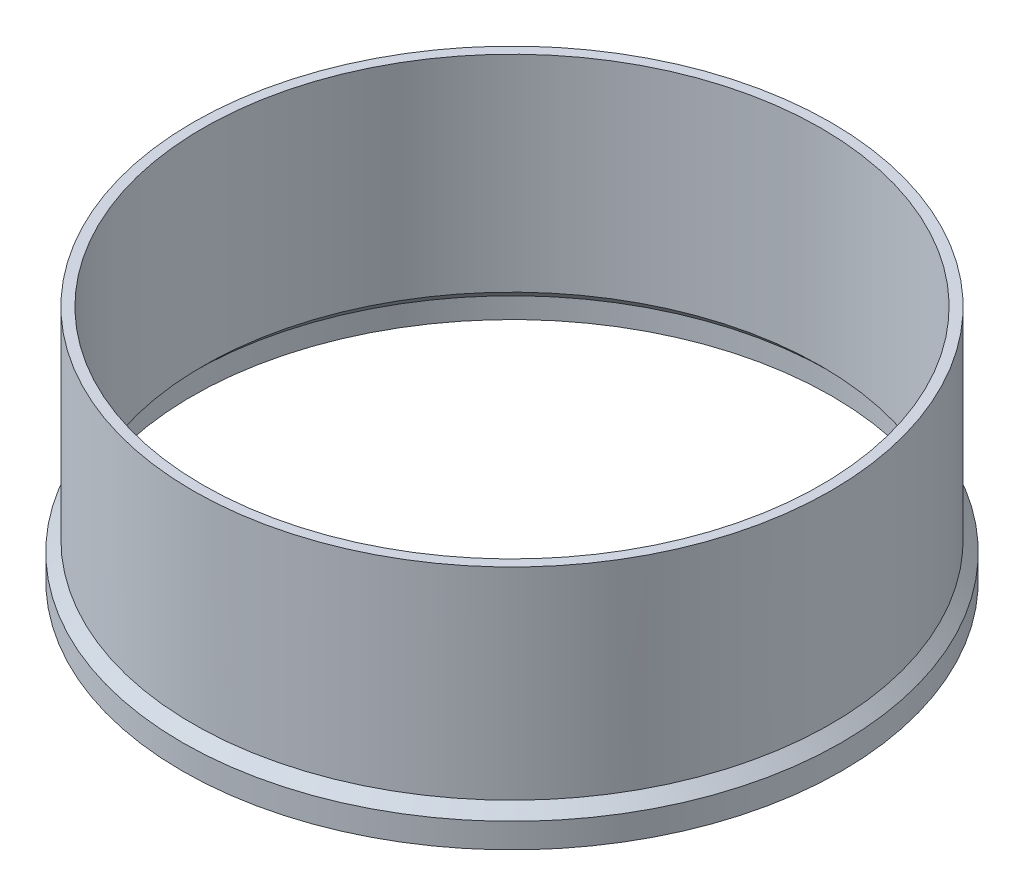
ISO-10303-21;
HEADER;
FILE_DESCRIPTION(('STEP AP214'),'2;1');
FILE_NAME('part.step','',(''),(''),'','','');
FILE_SCHEMA(('AUTOMOTIVE_DESIGN { 1 0 10303 214 1 1 1 1 }'));
ENDSEC;
DATA;
#1=APPLICATION_CONTEXT('core data for automotive mechanical design processes');
#2=APPLICATION_PROTOCOL_DEFINITION('international standard','automotive_design',2000,#1);
#3=PRODUCT_CONTEXT('',#1,'mechanical');
#4=PRODUCT('Part','Part','',(#3));
#5=PRODUCT_RELATED_PRODUCT_CATEGORY('part','',(#4));
#6=PRODUCT_DEFINITION_FORMATION('','',#4);
#7=PRODUCT_DEFINITION_CONTEXT('part definition',#1,'design');
#8=PRODUCT_DEFINITION('design','',#6,#7);
#9=PRODUCT_DEFINITION_SHAPE('','',#8);
#10=(LENGTH_UNIT() NAMED_UNIT(*) SI_UNIT(.MILLI.,.METRE.));
#11=(NAMED_UNIT(*) PLANE_ANGLE_UNIT() SI_UNIT($,.RADIAN.));
#12=(NAMED_UNIT(*) SI_UNIT($,.STERADIAN.) SOLID_ANGLE_UNIT());
#13=UNCERTAINTY_MEASURE_WITH_UNIT(LENGTH_MEASURE(1.E-05),#10,'distance_accuracy_value','');
#14=(GEOMETRIC_REPRESENTATION_CONTEXT(3) GLOBAL_UNCERTAINTY_ASSIGNED_CONTEXT((#13)) GLOBAL_UNIT_ASSIGNED_CONTEXT((#10,
#11,#12)) REPRESENTATION_CONTEXT('',''));
#15=CARTESIAN_POINT('',(0.,0.,0.));
#16=DIRECTION('',(0.,0.,1.));
#17=DIRECTION('',(1.,0.,0.));
#18=AXIS2_PLACEMENT_3D('',#15,#16,#17);
#19=CARTESIAN_POINT('',(0.,50.,0.));
#20=DIRECTION('',(0.,1.,0.));
#21=DIRECTION('',(0.,0.,1.));
#22=AXIS2_PLACEMENT_3D('',#19,#20,#21);
#23=PLANE('',#22);
#24=CARTESIAN_POINT('',(0.,50.,0.));
#25=DIRECTION('',(0.,1.,0.));
#26=DIRECTION('',(0.,0.,1.));
#27=AXIS2_PLACEMENT_3D('',#24,#25,#26);
#28=CIRCLE('',#27,77.4);
#29=CARTESIAN_POINT('',(0.,50.,77.4));
#30=VERTEX_POINT('',#29);
#31=EDGE_CURVE('E10',#30,#30,#28,.T.);
#32=ORIENTED_EDGE('',*,*,#31,.T.);
#33=EDGE_LOOP('',(#32));
#34=FACE_BOUND('',#33,.T.);
#35=CARTESIAN_POINT('',(0.,50.,0.));
#36=DIRECTION('',(0.,1.,0.));
#37=DIRECTION('',(0.,0.,1.));
#38=AXIS2_PLACEMENT_3D('',#35,#36,#37);
#39=CIRCLE('',#38,75.);
#40=CARTESIAN_POINT('',(0.,50.,75.));
#41=VERTEX_POINT('',#40);
#42=EDGE_CURVE('E37',#41,#41,#39,.T.);
#43=ORIENTED_EDGE('',*,*,#42,.F.);
#44=EDGE_LOOP('',(#43));
#45=FACE_BOUND('',#44,.T.);
#46=ADVANCED_FACE('F30',(#34,#45),#23,.T.);
#47=CARTESIAN_POINT('',(0.,50.,0.));
#48=DIRECTION('',(0.,-1.,0.));
#49=DIRECTION('',(0.,0.,-1.));
#50=AXIS2_PLACEMENT_3D('',#47,#48,#49);
#51=CYLINDRICAL_SURFACE('',#50,77.4);
#52=CARTESIAN_POINT('',(0.,0.994112549695437,0.));
#53=DIRECTION('',(0.,-1.,0.));
#54=DIRECTION('',(0.,0.,-1.));
#55=AXIS2_PLACEMENT_3D('',#52,#53,#54);
#56=CIRCLE('',#55,77.4);
#57=CARTESIAN_POINT('',(0.,0.994112549695437,-77.4));
#58=VERTEX_POINT('',#57);
#59=EDGE_CURVE('E59',#58,#58,#56,.T.);
#60=ORIENTED_EDGE('',*,*,#59,.F.);
#61=EDGE_LOOP('',(#60));
#62=FACE_BOUND('',#61,.T.);
#63=ORIENTED_EDGE('',*,*,#31,.F.);
#64=EDGE_LOOP('',(#63));
#65=FACE_BOUND('',#64,.T.);
#66=ADVANCED_FACE('F32',(#62,#65),#51,.T.);
#67=CARTESIAN_POINT('',(0.,50.,0.));
#68=DIRECTION('',(0.,-1.,0.));
#69=DIRECTION('',(0.,0.,-1.));
#70=AXIS2_PLACEMENT_3D('',#67,#68,#69);
#71=CYLINDRICAL_SURFACE('',#70,75.);
#72=ORIENTED_EDGE('',*,*,#42,.T.);
#73=EDGE_LOOP('',(#72));
#74=FACE_BOUND('',#73,.T.);
#75=CARTESIAN_POINT('',(0.,0.,0.));
#76=DIRECTION('',(0.,1.,0.));
#77=DIRECTION('',(0.,0.,1.));
#78=AXIS2_PLACEMENT_3D('',#75,#76,#77);
#79=CIRCLE('',#78,75.);
#80=CARTESIAN_POINT('',(0.,0.,75.));
#81=VERTEX_POINT('',#80);
#82=EDGE_CURVE('E41',#81,#81,#79,.T.);
#83=ORIENTED_EDGE('',*,*,#82,.F.);
#84=EDGE_LOOP('',(#83));
#85=FACE_BOUND('',#84,.T.);
#86=ADVANCED_FACE('F68',(#74,#85),#71,.F.);
#87=CARTESIAN_POINT('',(0.,0.,0.));
#88=DIRECTION('',(0.,-1.,0.));
#89=DIRECTION('',(0.,0.,-1.));
#90=AXIS2_PLACEMENT_3D('',#87,#88,#89);
#91=CONICAL_SURFACE('',#90,75.,0.785398163397447);
#92=CARTESIAN_POINT('',(0.,-2.59999999999999,0.));
#93=DIRECTION('',(0.,-1.,0.));
#94=DIRECTION('',(0.,0.,-1.));
#95=AXIS2_PLACEMENT_3D('',#92,#93,#94);
#96=CIRCLE('',#95,77.6);
#97=CARTESIAN_POINT('',(0.,-2.59999999999999,-77.6));
#98=VERTEX_POINT('',#97);
#99=EDGE_CURVE('E46',#98,#98,#96,.T.);
#100=ORIENTED_EDGE('',*,*,#99,.T.);
#101=EDGE_LOOP('',(#100));
#102=FACE_BOUND('',#101,.T.);
#103=ORIENTED_EDGE('',*,*,#82,.T.);
#104=EDGE_LOOP('',(#103));
#105=FACE_BOUND('',#104,.T.);
#106=ADVANCED_FACE('F73',(#102,#105),#91,.F.);
#107=CARTESIAN_POINT('',(0.,0.,0.));
#108=DIRECTION('',(0.,-1.,0.));
#109=DIRECTION('',(0.,0.,-1.));
#110=AXIS2_PLACEMENT_3D('',#107,#108,#109);
#111=CYLINDRICAL_SURFACE('',#110,77.6);
#112=CARTESIAN_POINT('',(0.,-7.59999999999999,0.));
#113=DIRECTION('',(0.,-1.,0.));
#114=DIRECTION('',(0.,0.,-1.));
#115=AXIS2_PLACEMENT_3D('',#112,#113,#114);
#116=CIRCLE('',#115,77.6);
#117=CARTESIAN_POINT('',(0.,-7.59999999999999,-77.6));
#118=VERTEX_POINT('',#117);
#119=EDGE_CURVE('E50',#118,#118,#116,.T.);
#120=ORIENTED_EDGE('',*,*,#119,.T.);
#121=EDGE_LOOP('',(#120));
#122=FACE_BOUND('',#121,.T.);
#123=ORIENTED_EDGE('',*,*,#99,.F.);
#124=EDGE_LOOP('',(#123));
#125=FACE_BOUND('',#124,.T.);
#126=ADVANCED_FACE('F81',(#122,#125),#111,.F.);
#127=CARTESIAN_POINT('',(77.6,-7.59999999999999,0.));
#128=DIRECTION('',(0.,-1.,0.));
#129=DIRECTION('',(0.,0.,-1.));
#130=AXIS2_PLACEMENT_3D('',#127,#128,#129);
#131=PLANE('',#130);
#132=CARTESIAN_POINT('',(0.,-7.59999999999999,0.));
#133=DIRECTION('',(0.,-1.,0.));
#134=DIRECTION('',(0.,0.,-1.));
#135=AXIS2_PLACEMENT_3D('',#132,#133,#134);
#136=CIRCLE('',#135,80.);
#137=CARTESIAN_POINT('',(0.,-7.59999999999999,-80.));
#138=VERTEX_POINT('',#137);
#139=EDGE_CURVE('E53',#138,#138,#136,.T.);
#140=ORIENTED_EDGE('',*,*,#139,.T.);
#141=EDGE_LOOP('',(#140));
#142=FACE_BOUND('',#141,.T.);
#143=ORIENTED_EDGE('',*,*,#119,.F.);
#144=EDGE_LOOP('',(#143));
#145=FACE_BOUND('',#144,.T.);
#146=ADVANCED_FACE('F85',(#142,#145),#131,.T.);
#147=CARTESIAN_POINT('',(0.,0.,0.));
#148=DIRECTION('',(0.,-1.,0.));
#149=DIRECTION('',(0.,0.,-1.));
#150=AXIS2_PLACEMENT_3D('',#147,#148,#149);
#151=CYLINDRICAL_SURFACE('',#150,80.);
#152=CARTESIAN_POINT('',(0.,-1.60588745030454,0.));
#153=DIRECTION('',(0.,-1.,0.));
#154=DIRECTION('',(0.,0.,-1.));
#155=AXIS2_PLACEMENT_3D('',#152,#153,#154);
#156=CIRCLE('',#155,80.);
#157=CARTESIAN_POINT('',(0.,-1.60588745030454,-80.));
#158=VERTEX_POINT('',#157);
#159=EDGE_CURVE('E56',#158,#158,#156,.T.);
#160=ORIENTED_EDGE('',*,*,#159,.T.);
#161=EDGE_LOOP('',(#160));
#162=FACE_BOUND('',#161,.T.);
#163=ORIENTED_EDGE('',*,*,#139,.F.);
#164=EDGE_LOOP('',(#163));
#165=FACE_BOUND('',#164,.T.);
#166=ADVANCED_FACE('F89',(#162,#165),#151,.T.);
#167=CARTESIAN_POINT('',(0.,-1.60588745030454,0.));
#168=DIRECTION('',(0.,-1.,0.));
#169=DIRECTION('',(0.,0.,-1.));
#170=AXIS2_PLACEMENT_3D('',#167,#168,#169);
#171=CONICAL_SURFACE('',#170,80.,0.785398163397448);
#172=ORIENTED_EDGE('',*,*,#59,.T.);
#173=EDGE_LOOP('',(#172));
#174=FACE_BOUND('',#173,.T.);
#175=ORIENTED_EDGE('',*,*,#159,.F.);
#176=EDGE_LOOP('',(#175));
#177=FACE_BOUND('',#176,.T.);
#178=ADVANCED_FACE('F63',(#174,#177),#171,.T.);
#179=CLOSED_SHELL('',(#46,#66,#86,#106,#126,#146,#166,#178));
#180=MANIFOLD_SOLID_BREP('B2',#179);
#181=ADVANCED_BREP_SHAPE_REPRESENTATION('',(#18,#180),#14);
#182=SHAPE_DEFINITION_REPRESENTATION(#9,#181);
ENDSEC;
END-ISO-10303-21;
